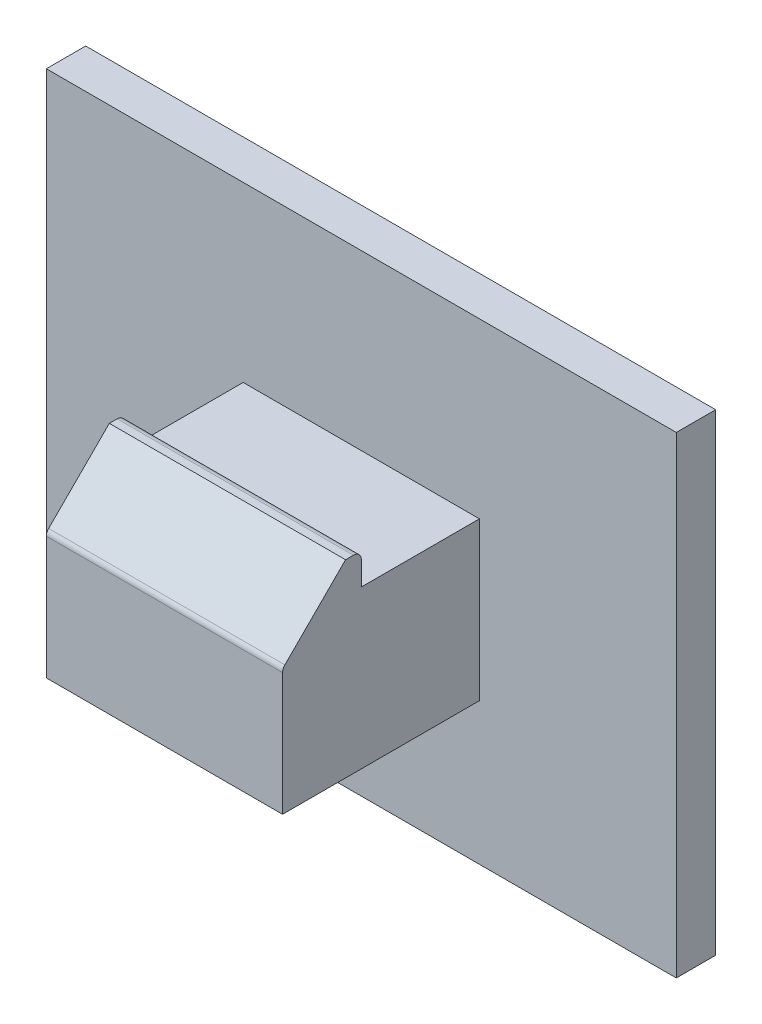
ISO-10303-21;
HEADER;
FILE_DESCRIPTION(('STEP AP214'),'2;1');
FILE_NAME('part.step','',(''),(''),'','','');
FILE_SCHEMA(('AUTOMOTIVE_DESIGN { 1 0 10303 214 1 1 1 1 }'));
ENDSEC;
DATA;
#1=APPLICATION_CONTEXT('core data for automotive mechanical design processes');
#2=APPLICATION_PROTOCOL_DEFINITION('international standard','automotive_design',2000,#1);
#3=PRODUCT_CONTEXT('',#1,'mechanical');
#4=PRODUCT('Part','Part','',(#3));
#5=PRODUCT_RELATED_PRODUCT_CATEGORY('part','',(#4));
#6=PRODUCT_DEFINITION_FORMATION('','',#4);
#7=PRODUCT_DEFINITION_CONTEXT('part definition',#1,'design');
#8=PRODUCT_DEFINITION('design','',#6,#7);
#9=PRODUCT_DEFINITION_SHAPE('','',#8);
#10=(LENGTH_UNIT() NAMED_UNIT(*) SI_UNIT(.MILLI.,.METRE.));
#11=(NAMED_UNIT(*) PLANE_ANGLE_UNIT() SI_UNIT($,.RADIAN.));
#12=(NAMED_UNIT(*) SI_UNIT($,.STERADIAN.) SOLID_ANGLE_UNIT());
#13=UNCERTAINTY_MEASURE_WITH_UNIT(LENGTH_MEASURE(1.E-05),#10,'distance_accuracy_value','');
#14=(GEOMETRIC_REPRESENTATION_CONTEXT(3) GLOBAL_UNCERTAINTY_ASSIGNED_CONTEXT((#13)) GLOBAL_UNIT_ASSIGNED_CONTEXT((#10,
#11,#12)) REPRESENTATION_CONTEXT('',''));
#15=CARTESIAN_POINT('',(0.,0.,0.));
#16=DIRECTION('',(0.,0.,1.));
#17=DIRECTION('',(1.,0.,0.));
#18=AXIS2_PLACEMENT_3D('',#15,#16,#17);
#19=CARTESIAN_POINT('',(0.,0.,-5.));
#20=DIRECTION('',(-1.,0.,0.));
#21=DIRECTION('',(0.,0.,1.));
#22=AXIS2_PLACEMENT_3D('',#19,#20,#21);
#23=PLANE('',#22);
#24=DIRECTION('',(0.,-1.,0.));
#25=VECTOR('',#24,1.);
#26=CARTESIAN_POINT('',(0.,0.,0.));
#27=LINE('',#26,#25);
#28=CARTESIAN_POINT('',(0.,60.,0.));
#29=VERTEX_POINT('',#28);
#30=CARTESIAN_POINT('',(0.,0.,0.));
#31=VERTEX_POINT('',#30);
#32=EDGE_CURVE('E164',#29,#31,#27,.T.);
#33=ORIENTED_EDGE('',*,*,#32,.F.);
#34=DIRECTION('',(0.,0.,1.));
#35=VECTOR('',#34,1.);
#36=CARTESIAN_POINT('',(0.,60.,-5.));
#37=LINE('',#36,#35);
#38=CARTESIAN_POINT('',(0.,60.,-5.));
#39=VERTEX_POINT('',#38);
#40=EDGE_CURVE('E194',#39,#29,#37,.T.);
#41=ORIENTED_EDGE('',*,*,#40,.F.);
#42=DIRECTION('',(0.,-1.,0.));
#43=VECTOR('',#42,1.);
#44=CARTESIAN_POINT('',(0.,0.,-5.));
#45=LINE('',#44,#43);
#46=CARTESIAN_POINT('',(0.,0.,-5.));
#47=VERTEX_POINT('',#46);
#48=EDGE_CURVE('E173',#39,#47,#45,.T.);
#49=ORIENTED_EDGE('',*,*,#48,.T.);
#50=DIRECTION('',(0.,0.,1.));
#51=VECTOR('',#50,1.);
#52=CARTESIAN_POINT('',(0.,0.,-5.));
#53=LINE('',#52,#51);
#54=EDGE_CURVE('E185',#47,#31,#53,.T.);
#55=ORIENTED_EDGE('',*,*,#54,.T.);
#56=EDGE_LOOP('',(#33,#41,#49,#55));
#57=FACE_BOUND('',#56,.T.);
#58=ADVANCED_FACE('F47',(#57),#23,.T.);
#59=CARTESIAN_POINT('',(0.,60.,-5.));
#60=DIRECTION('',(0.,1.,0.));
#61=DIRECTION('',(0.,0.,1.));
#62=AXIS2_PLACEMENT_3D('',#59,#60,#61);
#63=PLANE('',#62);
#64=DIRECTION('',(-1.,0.,0.));
#65=VECTOR('',#64,1.);
#66=CARTESIAN_POINT('',(0.,60.,0.));
#67=LINE('',#66,#65);
#68=CARTESIAN_POINT('',(80.,60.,0.));
#69=VERTEX_POINT('',#68);
#70=EDGE_CURVE('E177',#69,#29,#67,.T.);
#71=ORIENTED_EDGE('',*,*,#70,.F.);
#72=DIRECTION('',(0.,0.,1.));
#73=VECTOR('',#72,1.);
#74=CARTESIAN_POINT('',(80.,60.,-5.));
#75=LINE('',#74,#73);
#76=CARTESIAN_POINT('',(80.,60.,-5.));
#77=VERTEX_POINT('',#76);
#78=EDGE_CURVE('E197',#77,#69,#75,.T.);
#79=ORIENTED_EDGE('',*,*,#78,.F.);
#80=DIRECTION('',(-1.,0.,0.));
#81=VECTOR('',#80,1.);
#82=CARTESIAN_POINT('',(0.,60.,-5.));
#83=LINE('',#82,#81);
#84=EDGE_CURVE('E183',#77,#39,#83,.T.);
#85=ORIENTED_EDGE('',*,*,#84,.T.);
#86=ORIENTED_EDGE('',*,*,#40,.T.);
#87=EDGE_LOOP('',(#71,#79,#85,#86));
#88=FACE_BOUND('',#87,.T.);
#89=ADVANCED_FACE('F274',(#88),#63,.T.);
#90=CARTESIAN_POINT('',(80.,0.,-5.));
#91=DIRECTION('',(1.,0.,0.));
#92=DIRECTION('',(0.,0.,-1.));
#93=AXIS2_PLACEMENT_3D('',#90,#91,#92);
#94=PLANE('',#93);
#95=DIRECTION('',(0.,1.,0.));
#96=VECTOR('',#95,1.);
#97=CARTESIAN_POINT('',(80.,0.,0.));
#98=LINE('',#97,#96);
#99=CARTESIAN_POINT('',(80.,0.,0.));
#100=VERTEX_POINT('',#99);
#101=EDGE_CURVE('E189',#100,#69,#98,.T.);
#102=ORIENTED_EDGE('',*,*,#101,.F.);
#103=DIRECTION('',(0.,0.,1.));
#104=VECTOR('',#103,1.);
#105=CARTESIAN_POINT('',(80.,0.,-5.));
#106=LINE('',#105,#104);
#107=CARTESIAN_POINT('',(80.,0.,-5.));
#108=VERTEX_POINT('',#107);
#109=EDGE_CURVE('E199',#108,#100,#106,.T.);
#110=ORIENTED_EDGE('',*,*,#109,.F.);
#111=DIRECTION('',(0.,1.,0.));
#112=VECTOR('',#111,1.);
#113=CARTESIAN_POINT('',(80.,0.,-5.));
#114=LINE('',#113,#112);
#115=EDGE_CURVE('E180',#108,#77,#114,.T.);
#116=ORIENTED_EDGE('',*,*,#115,.T.);
#117=ORIENTED_EDGE('',*,*,#78,.T.);
#118=EDGE_LOOP('',(#102,#110,#116,#117));
#119=FACE_BOUND('',#118,.T.);
#120=ADVANCED_FACE('F280',(#119),#94,.T.);
#121=CARTESIAN_POINT('',(0.,0.,-5.));
#122=DIRECTION('',(0.,-1.,0.));
#123=DIRECTION('',(0.,0.,-1.));
#124=AXIS2_PLACEMENT_3D('',#121,#122,#123);
#125=PLANE('',#124);
#126=DIRECTION('',(1.,0.,0.));
#127=VECTOR('',#126,1.);
#128=CARTESIAN_POINT('',(0.,0.,0.));
#129=LINE('',#128,#127);
#130=EDGE_CURVE('E167',#31,#100,#129,.T.);
#131=ORIENTED_EDGE('',*,*,#130,.F.);
#132=ORIENTED_EDGE('',*,*,#54,.F.);
#133=DIRECTION('',(1.,0.,0.));
#134=VECTOR('',#133,1.);
#135=CARTESIAN_POINT('',(0.,0.,-5.));
#136=LINE('',#135,#134);
#137=EDGE_CURVE('E176',#47,#108,#136,.T.);
#138=ORIENTED_EDGE('',*,*,#137,.T.);
#139=ORIENTED_EDGE('',*,*,#109,.T.);
#140=EDGE_LOOP('',(#131,#132,#138,#139));
#141=FACE_BOUND('',#140,.T.);
#142=ADVANCED_FACE('F285',(#141),#125,.T.);
#143=CARTESIAN_POINT('',(0.,0.,-5.));
#144=DIRECTION('',(0.,0.,-1.));
#145=DIRECTION('',(-1.,0.,0.));
#146=AXIS2_PLACEMENT_3D('',#143,#144,#145);
#147=PLANE('',#146);
#148=ORIENTED_EDGE('',*,*,#48,.F.);
#149=ORIENTED_EDGE('',*,*,#84,.F.);
#150=ORIENTED_EDGE('',*,*,#115,.F.);
#151=ORIENTED_EDGE('',*,*,#137,.F.);
#152=EDGE_LOOP('',(#148,#149,#150,#151));
#153=FACE_BOUND('',#152,.T.);
#154=ADVANCED_FACE('F288',(#153),#147,.T.);
#155=CARTESIAN_POINT('',(0.,0.,0.));
#156=DIRECTION('',(0.,0.,-1.));
#157=DIRECTION('',(-1.,0.,0.));
#158=AXIS2_PLACEMENT_3D('',#155,#156,#157);
#159=PLANE('',#158);
#160=DIRECTION('',(1.,0.,0.));
#161=VECTOR('',#160,1.);
#162=CARTESIAN_POINT('',(0.,38.,0.));
#163=LINE('',#162,#161);
#164=CARTESIAN_POINT('',(25.,38.,0.));
#165=VERTEX_POINT('',#164);
#166=CARTESIAN_POINT('',(55.,38.,0.));
#167=VERTEX_POINT('',#166);
#168=EDGE_CURVE('E227',#165,#167,#163,.T.);
#169=ORIENTED_EDGE('',*,*,#168,.T.);
#170=DIRECTION('',(0.,-1.,0.));
#171=VECTOR('',#170,1.);
#172=CARTESIAN_POINT('',(55.,0.,0.));
#173=LINE('',#172,#171);
#174=CARTESIAN_POINT('',(55.,18.,0.));
#175=VERTEX_POINT('',#174);
#176=EDGE_CURVE('E162',#167,#175,#173,.T.);
#177=ORIENTED_EDGE('',*,*,#176,.T.);
#178=DIRECTION('',(1.,0.,0.));
#179=VECTOR('',#178,1.);
#180=CARTESIAN_POINT('',(0.,18.,0.));
#181=LINE('',#180,#179);
#182=CARTESIAN_POINT('',(25.,18.,0.));
#183=VERTEX_POINT('',#182);
#184=EDGE_CURVE('E235',#183,#175,#181,.T.);
#185=ORIENTED_EDGE('',*,*,#184,.F.);
#186=DIRECTION('',(0.,-1.,0.));
#187=VECTOR('',#186,1.);
#188=CARTESIAN_POINT('',(25.,0.,0.));
#189=LINE('',#188,#187);
#190=EDGE_CURVE('E242',#165,#183,#189,.T.);
#191=ORIENTED_EDGE('',*,*,#190,.F.);
#192=EDGE_LOOP('',(#169,#177,#185,#191));
#193=FACE_BOUND('',#192,.T.);
#194=ORIENTED_EDGE('',*,*,#32,.T.);
#195=ORIENTED_EDGE('',*,*,#130,.T.);
#196=ORIENTED_EDGE('',*,*,#101,.T.);
#197=ORIENTED_EDGE('',*,*,#70,.T.);
#198=EDGE_LOOP('',(#194,#195,#196,#197));
#199=FACE_BOUND('',#198,.T.);
#200=ADVANCED_FACE('F256',(#193,#199),#159,.F.);
#201=CARTESIAN_POINT('',(55.,0.,25.));
#202=DIRECTION('',(1.,0.,0.));
#203=DIRECTION('',(0.,1.,0.));
#204=AXIS2_PLACEMENT_3D('',#201,#202,#203);
#205=PLANE('',#204);
#206=DIRECTION('',(0.,0.707106781186544,-0.707106781186552));
#207=VECTOR('',#206,1.);
#208=CARTESIAN_POINT('',(55.,17.0000000000002,42.));
#209=LINE('',#208,#207);
#210=CARTESIAN_POINT('',(55.,34.2928932188135,24.7071067811865));
#211=VERTEX_POINT('',#210);
#212=CARTESIAN_POINT('',(55.,42.,16.9999999999999));
#213=VERTEX_POINT('',#212);
#214=EDGE_CURVE('E217',#211,#213,#209,.T.);
#215=ORIENTED_EDGE('',*,*,#214,.F.);
#216=CARTESIAN_POINT('',(55.,33.5857864376269,24.));
#217=DIRECTION('',(1.,0.,0.));
#218=DIRECTION('',(0.,1.,0.));
#219=AXIS2_PLACEMENT_3D('',#216,#217,#218);
#220=CIRCLE('',#219,1.);
#221=CARTESIAN_POINT('',(55.,33.5857864376269,25.));
#222=VERTEX_POINT('',#221);
#223=EDGE_CURVE('E69',#211,#222,#220,.T.);
#224=ORIENTED_EDGE('',*,*,#223,.T.);
#225=DIRECTION('',(0.,-1.,0.));
#226=VECTOR('',#225,1.);
#227=CARTESIAN_POINT('',(55.,0.,25.));
#228=LINE('',#227,#226);
#229=CARTESIAN_POINT('',(55.,18.,25.));
#230=VERTEX_POINT('',#229);
#231=EDGE_CURVE('E232',#222,#230,#228,.T.);
#232=ORIENTED_EDGE('',*,*,#231,.T.);
#233=DIRECTION('',(0.,0.,-1.));
#234=VECTOR('',#233,1.);
#235=CARTESIAN_POINT('',(55.,18.,25.));
#236=LINE('',#235,#234);
#237=EDGE_CURVE('E239',#230,#175,#236,.T.);
#238=ORIENTED_EDGE('',*,*,#237,.T.);
#239=ORIENTED_EDGE('',*,*,#176,.F.);
#240=DIRECTION('',(0.,0.,-1.));
#241=VECTOR('',#240,1.);
#242=CARTESIAN_POINT('',(55.,38.,25.));
#243=LINE('',#242,#241);
#244=CARTESIAN_POINT('',(55.,38.,15.));
#245=VERTEX_POINT('',#244);
#246=EDGE_CURVE('E155',#245,#167,#243,.T.);
#247=ORIENTED_EDGE('',*,*,#246,.F.);
#248=DIRECTION('',(0.,-1.,0.));
#249=VECTOR('',#248,1.);
#250=CARTESIAN_POINT('',(55.,0.,15.));
#251=LINE('',#250,#249);
#252=CARTESIAN_POINT('',(55.,41.,15.));
#253=VERTEX_POINT('',#252);
#254=EDGE_CURVE('E140',#253,#245,#251,.T.);
#255=ORIENTED_EDGE('',*,*,#254,.F.);
#256=CARTESIAN_POINT('',(55.,41.,16.));
#257=DIRECTION('',(1.,0.,0.));
#258=DIRECTION('',(0.,1.,0.));
#259=AXIS2_PLACEMENT_3D('',#256,#257,#258);
#260=CIRCLE('',#259,1.);
#261=CARTESIAN_POINT('',(55.,42.,16.));
#262=VERTEX_POINT('',#261);
#263=EDGE_CURVE('E207',#253,#262,#260,.T.);
#264=ORIENTED_EDGE('',*,*,#263,.T.);
#265=DIRECTION('',(0.,0.,1.));
#266=VECTOR('',#265,1.);
#267=CARTESIAN_POINT('',(55.,42.,0.));
#268=LINE('',#267,#266);
#269=EDGE_CURVE('E224',#262,#213,#268,.T.);
#270=ORIENTED_EDGE('',*,*,#269,.T.);
#271=EDGE_LOOP('',(#215,#224,#232,#238,#239,#247,#255,#264,#270));
#272=FACE_BOUND('',#271,.T.);
#273=ADVANCED_FACE('F160',(#272),#205,.T.);
#274=CARTESIAN_POINT('',(0.,38.,25.));
#275=DIRECTION('',(0.,1.,0.));
#276=DIRECTION('',(0.,0.,1.));
#277=AXIS2_PLACEMENT_3D('',#274,#275,#276);
#278=PLANE('',#277);
#279=DIRECTION('',(-1.,0.,0.));
#280=VECTOR('',#279,1.);
#281=CARTESIAN_POINT('',(62.211102550928,38.,15.));
#282=LINE('',#281,#280);
#283=CARTESIAN_POINT('',(25.,38.,15.));
#284=VERTEX_POINT('',#283);
#285=EDGE_CURVE('E144',#245,#284,#282,.T.);
#286=ORIENTED_EDGE('',*,*,#285,.F.);
#287=ORIENTED_EDGE('',*,*,#246,.T.);
#288=ORIENTED_EDGE('',*,*,#168,.F.);
#289=DIRECTION('',(0.,0.,-1.));
#290=VECTOR('',#289,1.);
#291=CARTESIAN_POINT('',(25.,38.,25.));
#292=LINE('',#291,#290);
#293=EDGE_CURVE('E157',#284,#165,#292,.T.);
#294=ORIENTED_EDGE('',*,*,#293,.F.);
#295=EDGE_LOOP('',(#286,#287,#288,#294));
#296=FACE_BOUND('',#295,.T.);
#297=ADVANCED_FACE('F153',(#296),#278,.T.);
#298=CARTESIAN_POINT('',(25.,0.,25.));
#299=DIRECTION('',(1.,0.,0.));
#300=DIRECTION('',(0.,1.,0.));
#301=AXIS2_PLACEMENT_3D('',#298,#299,#300);
#302=PLANE('',#301);
#303=DIRECTION('',(0.,-1.,0.));
#304=VECTOR('',#303,1.);
#305=CARTESIAN_POINT('',(25.,0.,25.));
#306=LINE('',#305,#304);
#307=CARTESIAN_POINT('',(25.,33.5857864376269,25.));
#308=VERTEX_POINT('',#307);
#309=CARTESIAN_POINT('',(25.,18.,25.));
#310=VERTEX_POINT('',#309);
#311=EDGE_CURVE('E234',#308,#310,#306,.T.);
#312=ORIENTED_EDGE('',*,*,#311,.F.);
#313=CARTESIAN_POINT('',(25.,33.5857864376269,24.));
#314=DIRECTION('',(1.,0.,0.));
#315=DIRECTION('',(0.,1.,0.));
#316=AXIS2_PLACEMENT_3D('',#313,#314,#315);
#317=CIRCLE('',#316,1.);
#318=CARTESIAN_POINT('',(25.,34.2928932188135,24.7071067811865));
#319=VERTEX_POINT('',#318);
#320=EDGE_CURVE('E11',#308,#319,#317,.F.);
#321=ORIENTED_EDGE('',*,*,#320,.T.);
#322=DIRECTION('',(0.,-0.707106781186544,0.707106781186552));
#323=VECTOR('',#322,1.);
#324=CARTESIAN_POINT('',(25.,29.5000000000002,29.4999999999999));
#325=LINE('',#324,#323);
#326=CARTESIAN_POINT('',(25.,42.,16.9999999999999));
#327=VERTEX_POINT('',#326);
#328=EDGE_CURVE('E220',#327,#319,#325,.T.);
#329=ORIENTED_EDGE('',*,*,#328,.F.);
#330=DIRECTION('',(0.,0.,1.));
#331=VECTOR('',#330,1.);
#332=CARTESIAN_POINT('',(25.,42.,0.));
#333=LINE('',#332,#331);
#334=CARTESIAN_POINT('',(25.,42.,16.));
#335=VERTEX_POINT('',#334);
#336=EDGE_CURVE('E158',#335,#327,#333,.T.);
#337=ORIENTED_EDGE('',*,*,#336,.F.);
#338=CARTESIAN_POINT('',(25.,41.,16.));
#339=DIRECTION('',(1.,0.,0.));
#340=DIRECTION('',(0.,1.,0.));
#341=AXIS2_PLACEMENT_3D('',#338,#339,#340);
#342=CIRCLE('',#341,1.);
#343=CARTESIAN_POINT('',(25.,41.,15.));
#344=VERTEX_POINT('',#343);
#345=EDGE_CURVE('E204',#335,#344,#342,.F.);
#346=ORIENTED_EDGE('',*,*,#345,.T.);
#347=DIRECTION('',(0.,-1.,0.));
#348=VECTOR('',#347,1.);
#349=CARTESIAN_POINT('',(25.,0.,15.));
#350=LINE('',#349,#348);
#351=EDGE_CURVE('E259',#344,#284,#350,.T.);
#352=ORIENTED_EDGE('',*,*,#351,.T.);
#353=ORIENTED_EDGE('',*,*,#293,.T.);
#354=ORIENTED_EDGE('',*,*,#190,.T.);
#355=DIRECTION('',(0.,0.,-1.));
#356=VECTOR('',#355,1.);
#357=CARTESIAN_POINT('',(25.,18.,25.));
#358=LINE('',#357,#356);
#359=EDGE_CURVE('E169',#310,#183,#358,.T.);
#360=ORIENTED_EDGE('',*,*,#359,.F.);
#361=EDGE_LOOP('',(#312,#321,#329,#337,#346,#352,#353,#354,#360));
#362=FACE_BOUND('',#361,.T.);
#363=ADVANCED_FACE('F258',(#362),#302,.F.);
#364=CARTESIAN_POINT('',(0.,18.,25.));
#365=DIRECTION('',(0.,1.,0.));
#366=DIRECTION('',(0.,0.,1.));
#367=AXIS2_PLACEMENT_3D('',#364,#365,#366);
#368=PLANE('',#367);
#369=ORIENTED_EDGE('',*,*,#184,.T.);
#370=ORIENTED_EDGE('',*,*,#237,.F.);
#371=DIRECTION('',(1.,0.,0.));
#372=VECTOR('',#371,1.);
#373=CARTESIAN_POINT('',(0.,18.,25.));
#374=LINE('',#373,#372);
#375=EDGE_CURVE('E237',#310,#230,#374,.T.);
#376=ORIENTED_EDGE('',*,*,#375,.F.);
#377=ORIENTED_EDGE('',*,*,#359,.T.);
#378=EDGE_LOOP('',(#369,#370,#376,#377));
#379=FACE_BOUND('',#378,.T.);
#380=ADVANCED_FACE('F251',(#379),#368,.F.);
#381=CARTESIAN_POINT('',(0.,0.,25.));
#382=DIRECTION('',(0.,0.,1.));
#383=DIRECTION('',(1.,0.,0.));
#384=AXIS2_PLACEMENT_3D('',#381,#382,#383);
#385=PLANE('',#384);
#386=ORIENTED_EDGE('',*,*,#231,.F.);
#387=DIRECTION('',(1.,0.,0.));
#388=VECTOR('',#387,1.);
#389=CARTESIAN_POINT('',(25.,33.5857864376269,25.));
#390=LINE('',#389,#388);
#391=EDGE_CURVE('E55',#222,#308,#390,.F.);
#392=ORIENTED_EDGE('',*,*,#391,.T.);
#393=ORIENTED_EDGE('',*,*,#311,.T.);
#394=ORIENTED_EDGE('',*,*,#375,.T.);
#395=EDGE_LOOP('',(#386,#392,#393,#394));
#396=FACE_BOUND('',#395,.T.);
#397=ADVANCED_FACE('F306',(#396),#385,.T.);
#398=CARTESIAN_POINT('',(80.,29.5000000000002,29.4999999999999));
#399=DIRECTION('',(0.,-0.707106781186552,-0.707106781186544));
#400=DIRECTION('',(0.,0.707106781186544,-0.707106781186552));
#401=AXIS2_PLACEMENT_3D('',#398,#399,#400);
#402=PLANE('',#401);
#403=ORIENTED_EDGE('',*,*,#328,.T.);
#404=DIRECTION('',(1.,0.,0.));
#405=VECTOR('',#404,1.);
#406=CARTESIAN_POINT('',(55.,34.2928932188135,24.7071067811865));
#407=LINE('',#406,#405);
#408=EDGE_CURVE('E209',#319,#211,#407,.T.);
#409=ORIENTED_EDGE('',*,*,#408,.T.);
#410=ORIENTED_EDGE('',*,*,#214,.T.);
#411=DIRECTION('',(-1.,0.,0.));
#412=VECTOR('',#411,1.);
#413=CARTESIAN_POINT('',(62.211102550928,42.,16.9999999999999));
#414=LINE('',#413,#412);
#415=EDGE_CURVE('E150',#213,#327,#414,.T.);
#416=ORIENTED_EDGE('',*,*,#415,.T.);
#417=EDGE_LOOP('',(#403,#409,#410,#416));
#418=FACE_BOUND('',#417,.T.);
#419=ADVANCED_FACE('F215',(#418),#402,.F.);
#420=CARTESIAN_POINT('',(62.211102550928,0.,15.));
#421=DIRECTION('',(0.,0.,-1.));
#422=DIRECTION('',(0.,1.,0.));
#423=AXIS2_PLACEMENT_3D('',#420,#421,#422);
#424=PLANE('',#423);
#425=ORIENTED_EDGE('',*,*,#351,.F.);
#426=DIRECTION('',(-1.,0.,0.));
#427=VECTOR('',#426,1.);
#428=CARTESIAN_POINT('',(55.,41.,15.));
#429=LINE('',#428,#427);
#430=EDGE_CURVE('E147',#344,#253,#429,.F.);
#431=ORIENTED_EDGE('',*,*,#430,.T.);
#432=ORIENTED_EDGE('',*,*,#254,.T.);
#433=ORIENTED_EDGE('',*,*,#285,.T.);
#434=EDGE_LOOP('',(#425,#431,#432,#433));
#435=FACE_BOUND('',#434,.T.);
#436=ADVANCED_FACE('F143',(#435),#424,.T.);
#437=CARTESIAN_POINT('',(62.211102550928,42.,0.));
#438=DIRECTION('',(0.,-1.,0.));
#439=DIRECTION('',(1.,0.,0.));
#440=AXIS2_PLACEMENT_3D('',#437,#438,#439);
#441=PLANE('',#440);
#442=ORIENTED_EDGE('',*,*,#269,.F.);
#443=DIRECTION('',(-1.,0.,0.));
#444=VECTOR('',#443,1.);
#445=CARTESIAN_POINT('',(25.,42.,16.));
#446=LINE('',#445,#444);
#447=EDGE_CURVE('E196',#262,#335,#446,.T.);
#448=ORIENTED_EDGE('',*,*,#447,.T.);
#449=ORIENTED_EDGE('',*,*,#336,.T.);
#450=ORIENTED_EDGE('',*,*,#415,.F.);
#451=EDGE_LOOP('',(#442,#448,#449,#450));
#452=FACE_BOUND('',#451,.T.);
#453=ADVANCED_FACE('F265',(#452),#441,.F.);
#454=CARTESIAN_POINT('',(62.211102550928,41.,16.));
#455=DIRECTION('',(1.,0.,0.));
#456=DIRECTION('',(0.,1.,0.));
#457=AXIS2_PLACEMENT_3D('',#454,#455,#456);
#458=CYLINDRICAL_SURFACE('',#457,1.);
#459=ORIENTED_EDGE('',*,*,#263,.F.);
#460=ORIENTED_EDGE('',*,*,#430,.F.);
#461=ORIENTED_EDGE('',*,*,#345,.F.);
#462=ORIENTED_EDGE('',*,*,#447,.F.);
#463=EDGE_LOOP('',(#459,#460,#461,#462));
#464=FACE_BOUND('',#463,.T.);
#465=ADVANCED_FACE('F268',(#464),#458,.T.);
#466=CARTESIAN_POINT('',(80.,33.5857864376269,24.));
#467=DIRECTION('',(-1.,0.,0.));
#468=DIRECTION('',(0.,-1.,0.));
#469=AXIS2_PLACEMENT_3D('',#466,#467,#468);
#470=CYLINDRICAL_SURFACE('',#469,1.);
#471=ORIENTED_EDGE('',*,*,#320,.F.);
#472=ORIENTED_EDGE('',*,*,#391,.F.);
#473=ORIENTED_EDGE('',*,*,#223,.F.);
#474=ORIENTED_EDGE('',*,*,#408,.F.);
#475=EDGE_LOOP('',(#471,#472,#473,#474));
#476=FACE_BOUND('',#475,.T.);
#477=ADVANCED_FACE('F49',(#476),#470,.T.);
#478=CLOSED_SHELL('',(#58,#89,#120,#142,#154,#200,#273,#297,#363,#380,#397,#419,#436,#453,#465,#477));
#479=MANIFOLD_SOLID_BREP('B2',#478);
#480=ADVANCED_BREP_SHAPE_REPRESENTATION('',(#18,#479),#14);
#481=SHAPE_DEFINITION_REPRESENTATION(#9,#480);
ENDSEC;
END-ISO-10303-21;
